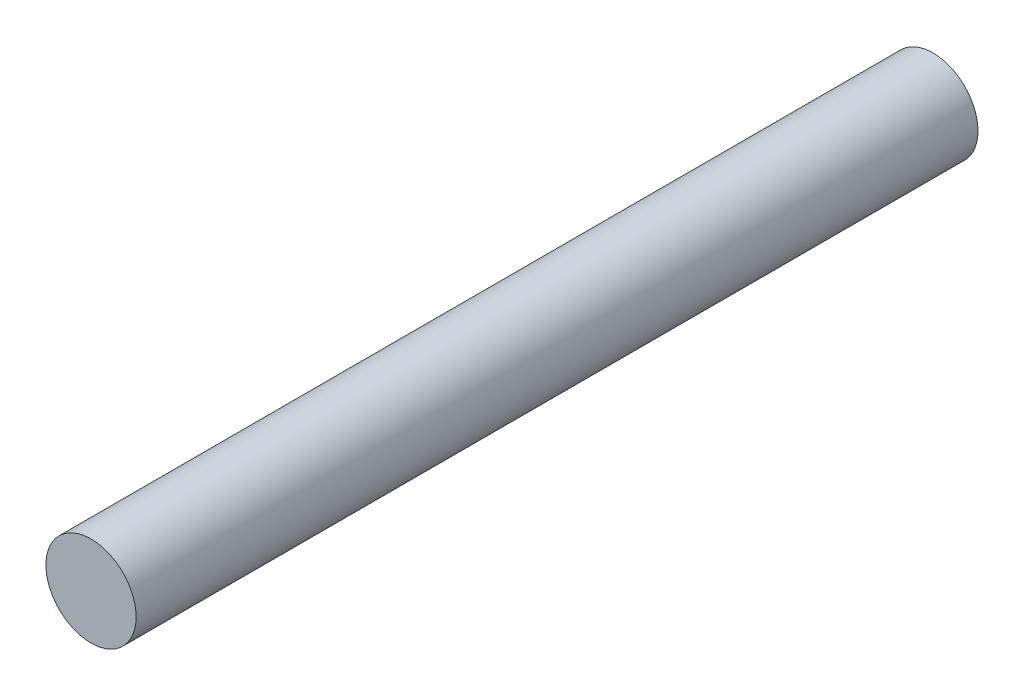
ISO-10303-21;
HEADER;
FILE_DESCRIPTION(('STEP AP214'),'2;1');
FILE_NAME('part.step','',(''),(''),'','','');
FILE_SCHEMA(('AUTOMOTIVE_DESIGN { 1 0 10303 214 1 1 1 1 }'));
ENDSEC;
DATA;
#1=APPLICATION_CONTEXT('core data for automotive mechanical design processes');
#2=APPLICATION_PROTOCOL_DEFINITION('international standard','automotive_design',2000,#1);
#3=PRODUCT_CONTEXT('',#1,'mechanical');
#4=PRODUCT('Part','Part','',(#3));
#5=PRODUCT_RELATED_PRODUCT_CATEGORY('part','',(#4));
#6=PRODUCT_DEFINITION_FORMATION('','',#4);
#7=PRODUCT_DEFINITION_CONTEXT('part definition',#1,'design');
#8=PRODUCT_DEFINITION('design','',#6,#7);
#9=PRODUCT_DEFINITION_SHAPE('','',#8);
#10=(LENGTH_UNIT() NAMED_UNIT(*) SI_UNIT(.MILLI.,.METRE.));
#11=(NAMED_UNIT(*) PLANE_ANGLE_UNIT() SI_UNIT($,.RADIAN.));
#12=(NAMED_UNIT(*) SI_UNIT($,.STERADIAN.) SOLID_ANGLE_UNIT());
#13=UNCERTAINTY_MEASURE_WITH_UNIT(LENGTH_MEASURE(1.E-05),#10,'distance_accuracy_value','');
#14=(GEOMETRIC_REPRESENTATION_CONTEXT(3) GLOBAL_UNCERTAINTY_ASSIGNED_CONTEXT((#13)) GLOBAL_UNIT_ASSIGNED_CONTEXT((#10,
#11,#12)) REPRESENTATION_CONTEXT('',''));
#15=CARTESIAN_POINT('',(0.,0.,0.));
#16=DIRECTION('',(0.,0.,1.));
#17=DIRECTION('',(1.,0.,0.));
#18=AXIS2_PLACEMENT_3D('',#15,#16,#17);
#19=CARTESIAN_POINT('',(-52.4489761758105,6.94838968246358,280.));
#20=DIRECTION('',(0.,0.,-1.));
#21=DIRECTION('',(-1.,0.,0.));
#22=AXIS2_PLACEMENT_3D('',#19,#20,#21);
#23=CYLINDRICAL_SURFACE('',#22,15.);
#24=CARTESIAN_POINT('',(-52.4489761758105,6.94838968246358,280.));
#25=DIRECTION('',(0.,0.,1.));
#26=DIRECTION('',(1.,0.,0.));
#27=AXIS2_PLACEMENT_3D('',#24,#25,#26);
#28=CIRCLE('',#27,15.);
#29=CARTESIAN_POINT('',(-37.4489761758105,6.94838968246358,280.));
#30=VERTEX_POINT('',#29);
#31=EDGE_CURVE('E10',#30,#30,#28,.T.);
#32=ORIENTED_EDGE('',*,*,#31,.F.);
#33=EDGE_LOOP('',(#32));
#34=FACE_BOUND('',#33,.T.);
#35=CARTESIAN_POINT('',(-52.4489761758105,6.94838968246358,0.));
#36=DIRECTION('',(0.,0.,1.));
#37=DIRECTION('',(1.,0.,0.));
#38=AXIS2_PLACEMENT_3D('',#35,#36,#37);
#39=CIRCLE('',#38,15.);
#40=CARTESIAN_POINT('',(-37.4489761758105,6.94838968246358,0.));
#41=VERTEX_POINT('',#40);
#42=EDGE_CURVE('E36',#41,#41,#39,.T.);
#43=ORIENTED_EDGE('',*,*,#42,.T.);
#44=EDGE_LOOP('',(#43));
#45=FACE_BOUND('',#44,.T.);
#46=ADVANCED_FACE('F33',(#34,#45),#23,.T.);
#47=CARTESIAN_POINT('',(-52.4489761758105,6.94838968246358,280.));
#48=DIRECTION('',(0.,0.,1.));
#49=DIRECTION('',(1.,0.,0.));
#50=AXIS2_PLACEMENT_3D('',#47,#48,#49);
#51=PLANE('',#50);
#52=ORIENTED_EDGE('',*,*,#31,.T.);
#53=EDGE_LOOP('',(#52));
#54=FACE_BOUND('',#53,.T.);
#55=ADVANCED_FACE('F48',(#54),#51,.T.);
#56=CARTESIAN_POINT('',(-52.4489761758105,6.94838968246358,0.));
#57=DIRECTION('',(0.,0.,1.));
#58=DIRECTION('',(1.,0.,0.));
#59=AXIS2_PLACEMENT_3D('',#56,#57,#58);
#60=PLANE('',#59);
#61=ORIENTED_EDGE('',*,*,#42,.F.);
#62=EDGE_LOOP('',(#61));
#63=FACE_BOUND('',#62,.T.);
#64=ADVANCED_FACE('F46',(#63),#60,.F.);
#65=CLOSED_SHELL('',(#46,#55,#64));
#66=MANIFOLD_SOLID_BREP('B2',#65);
#67=ADVANCED_BREP_SHAPE_REPRESENTATION('',(#18,#66),#14);
#68=SHAPE_DEFINITION_REPRESENTATION(#9,#67);
ENDSEC;
END-ISO-10303-21;
